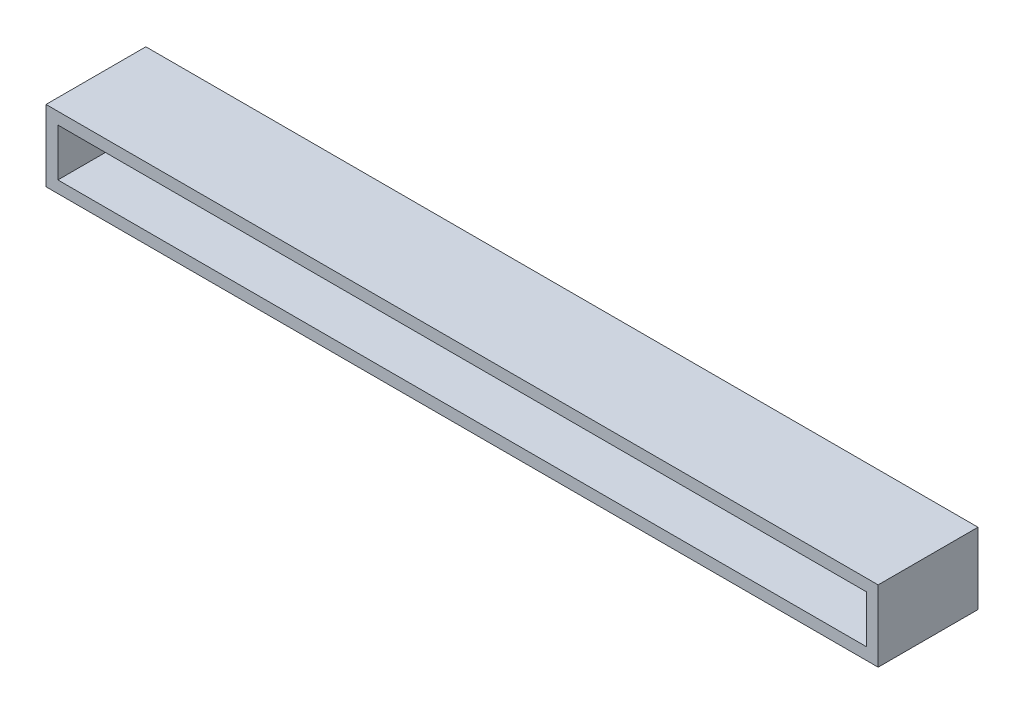
ISO-10303-21;
HEADER;
FILE_DESCRIPTION(('STEP AP214'),'2;1');
FILE_NAME('part.step','',(''),(''),'','','');
FILE_SCHEMA(('AUTOMOTIVE_DESIGN { 1 0 10303 214 1 1 1 1 }'));
ENDSEC;
DATA;
#1=APPLICATION_CONTEXT('core data for automotive mechanical design processes');
#2=APPLICATION_PROTOCOL_DEFINITION('international standard','automotive_design',2000,#1);
#3=PRODUCT_CONTEXT('',#1,'mechanical');
#4=PRODUCT('Part','Part','',(#3));
#5=PRODUCT_RELATED_PRODUCT_CATEGORY('part','',(#4));
#6=PRODUCT_DEFINITION_FORMATION('','',#4);
#7=PRODUCT_DEFINITION_CONTEXT('part definition',#1,'design');
#8=PRODUCT_DEFINITION('design','',#6,#7);
#9=PRODUCT_DEFINITION_SHAPE('','',#8);
#10=(LENGTH_UNIT() NAMED_UNIT(*) SI_UNIT(.MILLI.,.METRE.));
#11=(NAMED_UNIT(*) PLANE_ANGLE_UNIT() SI_UNIT($,.RADIAN.));
#12=(NAMED_UNIT(*) SI_UNIT($,.STERADIAN.) SOLID_ANGLE_UNIT());
#13=UNCERTAINTY_MEASURE_WITH_UNIT(LENGTH_MEASURE(1.E-05),#10,'distance_accuracy_value','');
#14=(GEOMETRIC_REPRESENTATION_CONTEXT(3) GLOBAL_UNCERTAINTY_ASSIGNED_CONTEXT((#13)) GLOBAL_UNIT_ASSIGNED_CONTEXT((#10,
#11,#12)) REPRESENTATION_CONTEXT('',''));
#15=CARTESIAN_POINT('',(0.,0.,0.));
#16=DIRECTION('',(0.,0.,1.));
#17=DIRECTION('',(1.,0.,0.));
#18=AXIS2_PLACEMENT_3D('',#15,#16,#17);
#19=CARTESIAN_POINT('',(0.,0.,2.54));
#20=DIRECTION('',(1.,0.,0.));
#21=DIRECTION('',(0.,0.,-1.));
#22=AXIS2_PLACEMENT_3D('',#19,#20,#21);
#23=PLANE('',#22);
#24=DIRECTION('',(0.,-1.,0.));
#25=VECTOR('',#24,1.);
#26=CARTESIAN_POINT('',(0.,0.,0.));
#27=LINE('',#26,#25);
#28=CARTESIAN_POINT('',(0.,15.24,0.));
#29=VERTEX_POINT('',#28);
#30=CARTESIAN_POINT('',(0.,0.,0.));
#31=VERTEX_POINT('',#30);
#32=EDGE_CURVE('E150',#29,#31,#27,.T.);
#33=ORIENTED_EDGE('',*,*,#32,.T.);
#34=DIRECTION('',(0.,0.,-1.));
#35=VECTOR('',#34,1.);
#36=CARTESIAN_POINT('',(0.,0.,2.54));
#37=LINE('',#36,#35);
#38=CARTESIAN_POINT('',(0.,0.,21.336));
#39=VERTEX_POINT('',#38);
#40=EDGE_CURVE('E11',#39,#31,#37,.T.);
#41=ORIENTED_EDGE('',*,*,#40,.F.);
#42=DIRECTION('',(0.,-1.,0.));
#43=VECTOR('',#42,1.);
#44=CARTESIAN_POINT('',(0.,15.24,21.336));
#45=LINE('',#44,#43);
#46=CARTESIAN_POINT('',(0.,15.24,21.336));
#47=VERTEX_POINT('',#46);
#48=EDGE_CURVE('E115',#47,#39,#45,.T.);
#49=ORIENTED_EDGE('',*,*,#48,.F.);
#50=DIRECTION('',(0.,0.,-1.));
#51=VECTOR('',#50,1.);
#52=CARTESIAN_POINT('',(0.,15.24,2.54));
#53=LINE('',#52,#51);
#54=EDGE_CURVE('E158',#47,#29,#53,.T.);
#55=ORIENTED_EDGE('',*,*,#54,.T.);
#56=EDGE_LOOP('',(#33,#41,#49,#55));
#57=FACE_BOUND('',#56,.T.);
#58=ADVANCED_FACE('F33',(#57),#23,.F.);
#59=CARTESIAN_POINT('',(0.,0.,2.54));
#60=DIRECTION('',(0.,1.,0.));
#61=DIRECTION('',(0.,0.,1.));
#62=AXIS2_PLACEMENT_3D('',#59,#60,#61);
#63=PLANE('',#62);
#64=DIRECTION('',(1.,0.,0.));
#65=VECTOR('',#64,1.);
#66=CARTESIAN_POINT('',(0.,0.,0.));
#67=LINE('',#66,#65);
#68=CARTESIAN_POINT('',(177.8,0.,0.));
#69=VERTEX_POINT('',#68);
#70=EDGE_CURVE('E153',#31,#69,#67,.T.);
#71=ORIENTED_EDGE('',*,*,#70,.T.);
#72=DIRECTION('',(0.,0.,-1.));
#73=VECTOR('',#72,1.);
#74=CARTESIAN_POINT('',(177.8,0.,2.54));
#75=LINE('',#74,#73);
#76=CARTESIAN_POINT('',(177.8,0.,21.336));
#77=VERTEX_POINT('',#76);
#78=EDGE_CURVE('E40',#77,#69,#75,.T.);
#79=ORIENTED_EDGE('',*,*,#78,.F.);
#80=DIRECTION('',(1.,0.,0.));
#81=VECTOR('',#80,1.);
#82=CARTESIAN_POINT('',(0.,0.,21.336));
#83=LINE('',#82,#81);
#84=EDGE_CURVE('E141',#39,#77,#83,.T.);
#85=ORIENTED_EDGE('',*,*,#84,.F.);
#86=ORIENTED_EDGE('',*,*,#40,.T.);
#87=EDGE_LOOP('',(#71,#79,#85,#86));
#88=FACE_BOUND('',#87,.T.);
#89=ADVANCED_FACE('F176',(#88),#63,.F.);
#90=CARTESIAN_POINT('',(177.8,0.,2.54));
#91=DIRECTION('',(-1.,0.,0.));
#92=DIRECTION('',(0.,0.,1.));
#93=AXIS2_PLACEMENT_3D('',#90,#91,#92);
#94=PLANE('',#93);
#95=DIRECTION('',(0.,1.,0.));
#96=VECTOR('',#95,1.);
#97=CARTESIAN_POINT('',(177.8,0.,0.));
#98=LINE('',#97,#96);
#99=CARTESIAN_POINT('',(177.8,15.24,0.));
#100=VERTEX_POINT('',#99);
#101=EDGE_CURVE('E155',#69,#100,#98,.T.);
#102=ORIENTED_EDGE('',*,*,#101,.T.);
#103=DIRECTION('',(0.,0.,-1.));
#104=VECTOR('',#103,1.);
#105=CARTESIAN_POINT('',(177.8,15.24,2.54));
#106=LINE('',#105,#104);
#107=CARTESIAN_POINT('',(177.8,15.24,21.336));
#108=VERTEX_POINT('',#107);
#109=EDGE_CURVE('E160',#108,#100,#106,.T.);
#110=ORIENTED_EDGE('',*,*,#109,.F.);
#111=DIRECTION('',(0.,1.,0.));
#112=VECTOR('',#111,1.);
#113=CARTESIAN_POINT('',(177.8,15.24,21.336));
#114=LINE('',#113,#112);
#115=EDGE_CURVE('E144',#77,#108,#114,.T.);
#116=ORIENTED_EDGE('',*,*,#115,.F.);
#117=ORIENTED_EDGE('',*,*,#78,.T.);
#118=EDGE_LOOP('',(#102,#110,#116,#117));
#119=FACE_BOUND('',#118,.T.);
#120=ADVANCED_FACE('F165',(#119),#94,.F.);
#121=CARTESIAN_POINT('',(0.,15.24,2.54));
#122=DIRECTION('',(0.,-1.,0.));
#123=DIRECTION('',(0.,0.,-1.));
#124=AXIS2_PLACEMENT_3D('',#121,#122,#123);
#125=PLANE('',#124);
#126=DIRECTION('',(-1.,0.,0.));
#127=VECTOR('',#126,1.);
#128=CARTESIAN_POINT('',(0.,15.24,0.));
#129=LINE('',#128,#127);
#130=EDGE_CURVE('E55',#100,#29,#129,.T.);
#131=ORIENTED_EDGE('',*,*,#130,.T.);
#132=ORIENTED_EDGE('',*,*,#54,.F.);
#133=DIRECTION('',(-1.,0.,0.));
#134=VECTOR('',#133,1.);
#135=CARTESIAN_POINT('',(0.,15.24,21.336));
#136=LINE('',#135,#134);
#137=EDGE_CURVE('E147',#108,#47,#136,.T.);
#138=ORIENTED_EDGE('',*,*,#137,.F.);
#139=ORIENTED_EDGE('',*,*,#109,.T.);
#140=EDGE_LOOP('',(#131,#132,#138,#139));
#141=FACE_BOUND('',#140,.T.);
#142=ADVANCED_FACE('F174',(#141),#125,.F.);
#143=CARTESIAN_POINT('',(0.,0.,0.));
#144=DIRECTION('',(0.,0.,-1.));
#145=DIRECTION('',(-1.,0.,0.));
#146=AXIS2_PLACEMENT_3D('',#143,#144,#145);
#147=PLANE('',#146);
#148=ORIENTED_EDGE('',*,*,#32,.F.);
#149=ORIENTED_EDGE('',*,*,#130,.F.);
#150=ORIENTED_EDGE('',*,*,#101,.F.);
#151=ORIENTED_EDGE('',*,*,#70,.F.);
#152=EDGE_LOOP('',(#148,#149,#150,#151));
#153=FACE_BOUND('',#152,.T.);
#154=ADVANCED_FACE('F170',(#153),#147,.T.);
#155=CARTESIAN_POINT('',(0.,0.,21.336));
#156=DIRECTION('',(0.,0.,1.));
#157=DIRECTION('',(1.,0.,0.));
#158=AXIS2_PLACEMENT_3D('',#155,#156,#157);
#159=PLANE('',#158);
#160=ORIENTED_EDGE('',*,*,#48,.T.);
#161=ORIENTED_EDGE('',*,*,#84,.T.);
#162=ORIENTED_EDGE('',*,*,#115,.T.);
#163=ORIENTED_EDGE('',*,*,#137,.T.);
#164=EDGE_LOOP('',(#160,#161,#162,#163));
#165=FACE_BOUND('',#164,.T.);
#166=DIRECTION('',(0.,-1.,0.));
#167=VECTOR('',#166,1.);
#168=CARTESIAN_POINT('',(2.54,12.7,21.336));
#169=LINE('',#168,#167);
#170=CARTESIAN_POINT('',(2.54,12.7,21.336));
#171=VERTEX_POINT('',#170);
#172=CARTESIAN_POINT('',(2.54,2.54,21.336));
#173=VERTEX_POINT('',#172);
#174=EDGE_CURVE('E107',#171,#173,#169,.T.);
#175=ORIENTED_EDGE('',*,*,#174,.F.);
#176=DIRECTION('',(-1.,0.,0.));
#177=VECTOR('',#176,1.);
#178=CARTESIAN_POINT('',(2.54,12.7,21.336));
#179=LINE('',#178,#177);
#180=CARTESIAN_POINT('',(175.26,12.7,21.336));
#181=VERTEX_POINT('',#180);
#182=EDGE_CURVE('E99',#181,#171,#179,.T.);
#183=ORIENTED_EDGE('',*,*,#182,.F.);
#184=DIRECTION('',(0.,1.,0.));
#185=VECTOR('',#184,1.);
#186=CARTESIAN_POINT('',(175.26,12.7,21.336));
#187=LINE('',#186,#185);
#188=CARTESIAN_POINT('',(175.26,2.54,21.336));
#189=VERTEX_POINT('',#188);
#190=EDGE_CURVE('E123',#189,#181,#187,.T.);
#191=ORIENTED_EDGE('',*,*,#190,.F.);
#192=DIRECTION('',(1.,0.,0.));
#193=VECTOR('',#192,1.);
#194=CARTESIAN_POINT('',(2.54,2.54,21.336));
#195=LINE('',#194,#193);
#196=EDGE_CURVE('E121',#173,#189,#195,.T.);
#197=ORIENTED_EDGE('',*,*,#196,.F.);
#198=EDGE_LOOP('',(#175,#183,#191,#197));
#199=FACE_BOUND('',#198,.T.);
#200=ADVANCED_FACE('F119',(#165,#199),#159,.T.);
#201=CARTESIAN_POINT('',(2.54,12.7,21.336));
#202=DIRECTION('',(0.,-1.,0.));
#203=DIRECTION('',(0.,0.,-1.));
#204=AXIS2_PLACEMENT_3D('',#201,#202,#203);
#205=PLANE('',#204);
#206=DIRECTION('',(-1.,0.,0.));
#207=VECTOR('',#206,1.);
#208=CARTESIAN_POINT('',(2.54,12.7,2.54));
#209=LINE('',#208,#207);
#210=CARTESIAN_POINT('',(175.26,12.7,2.54));
#211=VERTEX_POINT('',#210);
#212=CARTESIAN_POINT('',(2.54,12.7,2.54));
#213=VERTEX_POINT('',#212);
#214=EDGE_CURVE('E127',#211,#213,#209,.T.);
#215=ORIENTED_EDGE('',*,*,#214,.F.);
#216=DIRECTION('',(0.,0.,-1.));
#217=VECTOR('',#216,1.);
#218=CARTESIAN_POINT('',(175.26,12.7,21.336));
#219=LINE('',#218,#217);
#220=EDGE_CURVE('E47',#181,#211,#219,.T.);
#221=ORIENTED_EDGE('',*,*,#220,.F.);
#222=ORIENTED_EDGE('',*,*,#182,.T.);
#223=DIRECTION('',(0.,0.,-1.));
#224=VECTOR('',#223,1.);
#225=CARTESIAN_POINT('',(2.54,12.7,21.336));
#226=LINE('',#225,#224);
#227=EDGE_CURVE('E102',#171,#213,#226,.T.);
#228=ORIENTED_EDGE('',*,*,#227,.T.);
#229=EDGE_LOOP('',(#215,#221,#222,#228));
#230=FACE_BOUND('',#229,.T.);
#231=ADVANCED_FACE('F101',(#230),#205,.T.);
#232=CARTESIAN_POINT('',(2.54,12.7,21.336));
#233=DIRECTION('',(1.,0.,0.));
#234=DIRECTION('',(0.,0.,-1.));
#235=AXIS2_PLACEMENT_3D('',#232,#233,#234);
#236=PLANE('',#235);
#237=DIRECTION('',(0.,-1.,0.));
#238=VECTOR('',#237,1.);
#239=CARTESIAN_POINT('',(2.54,12.7,2.54));
#240=LINE('',#239,#238);
#241=CARTESIAN_POINT('',(2.54,2.54,2.54));
#242=VERTEX_POINT('',#241);
#243=EDGE_CURVE('E114',#213,#242,#240,.T.);
#244=ORIENTED_EDGE('',*,*,#243,.F.);
#245=ORIENTED_EDGE('',*,*,#227,.F.);
#246=ORIENTED_EDGE('',*,*,#174,.T.);
#247=DIRECTION('',(0.,0.,-1.));
#248=VECTOR('',#247,1.);
#249=CARTESIAN_POINT('',(2.54,2.54,21.336));
#250=LINE('',#249,#248);
#251=EDGE_CURVE('E116',#173,#242,#250,.T.);
#252=ORIENTED_EDGE('',*,*,#251,.T.);
#253=EDGE_LOOP('',(#244,#245,#246,#252));
#254=FACE_BOUND('',#253,.T.);
#255=ADVANCED_FACE('F111',(#254),#236,.T.);
#256=CARTESIAN_POINT('',(2.54,2.54,21.336));
#257=DIRECTION('',(0.,1.,0.));
#258=DIRECTION('',(-1.,0.,0.));
#259=AXIS2_PLACEMENT_3D('',#256,#257,#258);
#260=PLANE('',#259);
#261=DIRECTION('',(1.,0.,0.));
#262=VECTOR('',#261,1.);
#263=CARTESIAN_POINT('',(2.54,2.54,2.54));
#264=LINE('',#263,#262);
#265=CARTESIAN_POINT('',(175.26,2.54,2.54));
#266=VERTEX_POINT('',#265);
#267=EDGE_CURVE('E130',#242,#266,#264,.T.);
#268=ORIENTED_EDGE('',*,*,#267,.F.);
#269=ORIENTED_EDGE('',*,*,#251,.F.);
#270=ORIENTED_EDGE('',*,*,#196,.T.);
#271=DIRECTION('',(0.,0.,-1.));
#272=VECTOR('',#271,1.);
#273=CARTESIAN_POINT('',(175.26,2.54,21.336));
#274=LINE('',#273,#272);
#275=EDGE_CURVE('E136',#189,#266,#274,.T.);
#276=ORIENTED_EDGE('',*,*,#275,.T.);
#277=EDGE_LOOP('',(#268,#269,#270,#276));
#278=FACE_BOUND('',#277,.T.);
#279=ADVANCED_FACE('F199',(#278),#260,.T.);
#280=CARTESIAN_POINT('',(175.26,12.7,21.336));
#281=DIRECTION('',(-1.,0.,0.));
#282=DIRECTION('',(0.,0.,1.));
#283=AXIS2_PLACEMENT_3D('',#280,#281,#282);
#284=PLANE('',#283);
#285=DIRECTION('',(0.,1.,0.));
#286=VECTOR('',#285,1.);
#287=CARTESIAN_POINT('',(175.26,12.7,2.54));
#288=LINE('',#287,#286);
#289=EDGE_CURVE('E108',#266,#211,#288,.T.);
#290=ORIENTED_EDGE('',*,*,#289,.F.);
#291=ORIENTED_EDGE('',*,*,#275,.F.);
#292=ORIENTED_EDGE('',*,*,#190,.T.);
#293=ORIENTED_EDGE('',*,*,#220,.T.);
#294=EDGE_LOOP('',(#290,#291,#292,#293));
#295=FACE_BOUND('',#294,.T.);
#296=ADVANCED_FACE('F191',(#295),#284,.T.);
#297=CARTESIAN_POINT('',(0.,0.,2.54));
#298=DIRECTION('',(0.,0.,-1.));
#299=DIRECTION('',(-1.,0.,0.));
#300=AXIS2_PLACEMENT_3D('',#297,#298,#299);
#301=PLANE('',#300);
#302=ORIENTED_EDGE('',*,*,#289,.T.);
#303=ORIENTED_EDGE('',*,*,#214,.T.);
#304=ORIENTED_EDGE('',*,*,#243,.T.);
#305=ORIENTED_EDGE('',*,*,#267,.T.);
#306=EDGE_LOOP('',(#302,#303,#304,#305));
#307=FACE_BOUND('',#306,.T.);
#308=ADVANCED_FACE('F188',(#307),#301,.F.);
#309=CLOSED_SHELL('',(#58,#89,#120,#142,#154,#200,#231,#255,#279,#296,#308));
#310=MANIFOLD_SOLID_BREP('B2',#309);
#311=ADVANCED_BREP_SHAPE_REPRESENTATION('',(#18,#310),#14);
#312=SHAPE_DEFINITION_REPRESENTATION(#9,#311);
ENDSEC;
END-ISO-10303-21;
